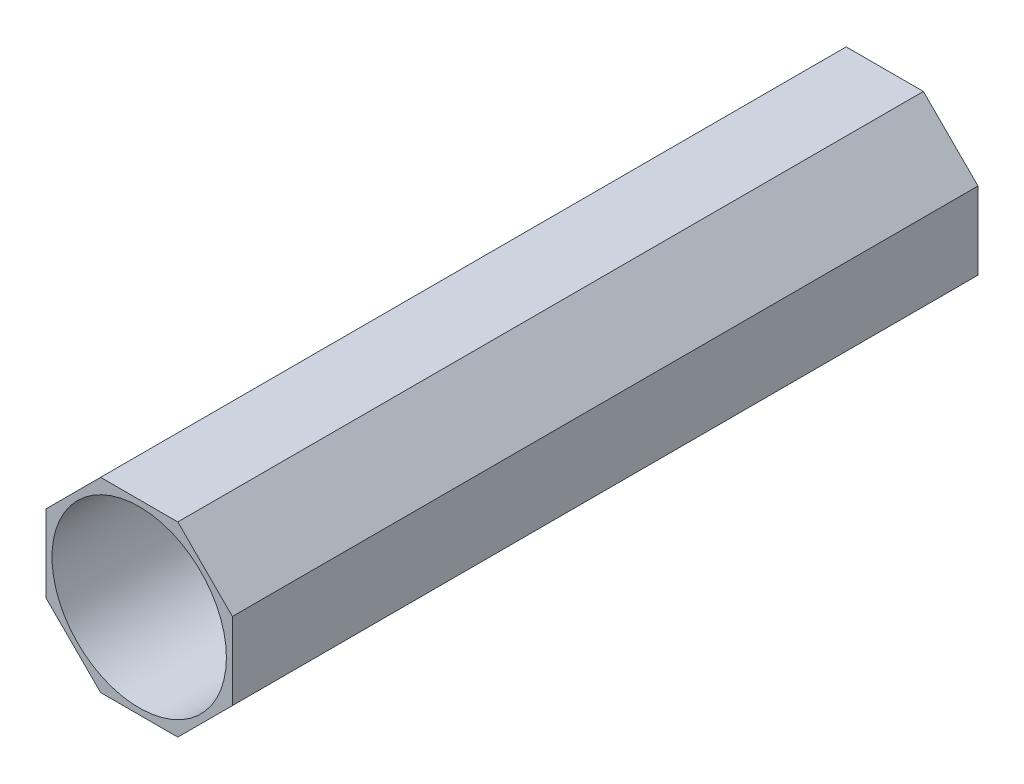
ISO-10303-21;
HEADER;
FILE_DESCRIPTION(('STEP AP214'),'2;1');
FILE_NAME('part.step','',(''),(''),'','','');
FILE_SCHEMA(('AUTOMOTIVE_DESIGN { 1 0 10303 214 1 1 1 1 }'));
ENDSEC;
DATA;
#1=APPLICATION_CONTEXT('core data for automotive mechanical design processes');
#2=APPLICATION_PROTOCOL_DEFINITION('international standard','automotive_design',2000,#1);
#3=PRODUCT_CONTEXT('',#1,'mechanical');
#4=PRODUCT('Part','Part','',(#3));
#5=PRODUCT_RELATED_PRODUCT_CATEGORY('part','',(#4));
#6=PRODUCT_DEFINITION_FORMATION('','',#4);
#7=PRODUCT_DEFINITION_CONTEXT('part definition',#1,'design');
#8=PRODUCT_DEFINITION('design','',#6,#7);
#9=PRODUCT_DEFINITION_SHAPE('','',#8);
#10=(LENGTH_UNIT() NAMED_UNIT(*) SI_UNIT(.MILLI.,.METRE.));
#11=(NAMED_UNIT(*) PLANE_ANGLE_UNIT() SI_UNIT($,.RADIAN.));
#12=(NAMED_UNIT(*) SI_UNIT($,.STERADIAN.) SOLID_ANGLE_UNIT());
#13=UNCERTAINTY_MEASURE_WITH_UNIT(LENGTH_MEASURE(1.E-05),#10,'distance_accuracy_value','');
#14=(GEOMETRIC_REPRESENTATION_CONTEXT(3) GLOBAL_UNCERTAINTY_ASSIGNED_CONTEXT((#13)) GLOBAL_UNIT_ASSIGNED_CONTEXT((#10,
#11,#12)) REPRESENTATION_CONTEXT('',''));
#15=CARTESIAN_POINT('',(0.,0.,0.));
#16=DIRECTION('',(0.,0.,1.));
#17=DIRECTION('',(1.,0.,0.));
#18=AXIS2_PLACEMENT_3D('',#15,#16,#17);
#19=CARTESIAN_POINT('',(0.,0.,50.));
#20=DIRECTION('',(0.,0.,1.));
#21=DIRECTION('',(1.,0.,0.));
#22=AXIS2_PLACEMENT_3D('',#19,#20,#21);
#23=PLANE('',#22);
#24=CARTESIAN_POINT('',(0.,0.,50.));
#25=DIRECTION('',(0.,0.,1.));
#26=DIRECTION('',(1.,0.,0.));
#27=AXIS2_PLACEMENT_3D('',#24,#25,#26);
#28=CIRCLE('',#27,11.);
#29=CARTESIAN_POINT('',(11.,0.,50.));
#30=VERTEX_POINT('',#29);
#31=EDGE_CURVE('E175',#30,#30,#28,.T.);
#32=ORIENTED_EDGE('',*,*,#31,.F.);
#33=EDGE_LOOP('',(#32));
#34=FACE_BOUND('',#33,.T.);
#35=CARTESIAN_POINT('',(0.,0.,50.));
#36=DIRECTION('',(0.,0.,1.));
#37=DIRECTION('',(1.,0.,0.));
#38=AXIS2_PLACEMENT_3D('',#35,#36,#37);
#39=CIRCLE('',#38,21.05);
#40=CARTESIAN_POINT('',(21.05,0.,50.));
#41=VERTEX_POINT('',#40);
#42=EDGE_CURVE('E102',#41,#41,#39,.T.);
#43=ORIENTED_EDGE('',*,*,#42,.T.);
#44=EDGE_LOOP('',(#43));
#45=FACE_BOUND('',#44,.T.);
#46=ADVANCED_FACE('F33',(#34,#45),#23,.T.);
#47=CARTESIAN_POINT('',(0.,0.,0.));
#48=DIRECTION('',(0.,0.,1.));
#49=DIRECTION('',(1.,0.,0.));
#50=AXIS2_PLACEMENT_3D('',#47,#48,#49);
#51=PLANE('',#50);
#52=CARTESIAN_POINT('',(0.,0.,0.));
#53=DIRECTION('',(0.,0.,1.));
#54=DIRECTION('',(1.,0.,0.));
#55=AXIS2_PLACEMENT_3D('',#52,#53,#54);
#56=CIRCLE('',#55,15.95);
#57=CARTESIAN_POINT('',(15.95,0.,0.));
#58=VERTEX_POINT('',#57);
#59=EDGE_CURVE('E186',#58,#58,#56,.T.);
#60=ORIENTED_EDGE('',*,*,#59,.T.);
#61=EDGE_LOOP('',(#60));
#62=FACE_BOUND('',#61,.T.);
#63=CARTESIAN_POINT('',(0.,0.,0.));
#64=DIRECTION('',(0.,0.,1.));
#65=DIRECTION('',(1.,0.,0.));
#66=AXIS2_PLACEMENT_3D('',#63,#64,#65);
#67=CIRCLE('',#66,21.05);
#68=CARTESIAN_POINT('',(21.05,0.,0.));
#69=VERTEX_POINT('',#68);
#70=EDGE_CURVE('E11',#69,#69,#67,.T.);
#71=ORIENTED_EDGE('',*,*,#70,.F.);
#72=EDGE_LOOP('',(#71));
#73=FACE_BOUND('',#72,.T.);
#74=ADVANCED_FACE('F191',(#62,#73),#51,.F.);
#75=CARTESIAN_POINT('',(0.,0.,-2.));
#76=DIRECTION('',(0.,0.,1.));
#77=DIRECTION('',(1.,0.,0.));
#78=AXIS2_PLACEMENT_3D('',#75,#76,#77);
#79=CYLINDRICAL_SURFACE('',#78,15.95);
#80=CARTESIAN_POINT('',(0.,0.,-2.));
#81=DIRECTION('',(0.,0.,1.));
#82=DIRECTION('',(1.,0.,0.));
#83=AXIS2_PLACEMENT_3D('',#80,#81,#82);
#84=CIRCLE('',#83,15.95);
#85=CARTESIAN_POINT('',(15.95,0.,-2.));
#86=VERTEX_POINT('',#85);
#87=EDGE_CURVE('E41',#86,#86,#84,.T.);
#88=ORIENTED_EDGE('',*,*,#87,.T.);
#89=EDGE_LOOP('',(#88));
#90=FACE_BOUND('',#89,.T.);
#91=ORIENTED_EDGE('',*,*,#59,.F.);
#92=EDGE_LOOP('',(#91));
#93=FACE_BOUND('',#92,.T.);
#94=ADVANCED_FACE('F35',(#90,#93),#79,.T.);
#95=CARTESIAN_POINT('',(0.,0.,-2.));
#96=DIRECTION('',(0.,0.,1.));
#97=DIRECTION('',(1.,0.,0.));
#98=AXIS2_PLACEMENT_3D('',#95,#96,#97);
#99=PLANE('',#98);
#100=CARTESIAN_POINT('',(0.,0.,-2.));
#101=DIRECTION('',(0.,0.,1.));
#102=DIRECTION('',(1.,0.,0.));
#103=AXIS2_PLACEMENT_3D('',#100,#101,#102);
#104=CIRCLE('',#103,14.05);
#105=CARTESIAN_POINT('',(14.05,0.,-2.));
#106=VERTEX_POINT('',#105);
#107=EDGE_CURVE('E183',#106,#106,#104,.T.);
#108=ORIENTED_EDGE('',*,*,#107,.T.);
#109=EDGE_LOOP('',(#108));
#110=FACE_BOUND('',#109,.T.);
#111=ORIENTED_EDGE('',*,*,#87,.F.);
#112=EDGE_LOOP('',(#111));
#113=FACE_BOUND('',#112,.T.);
#114=ADVANCED_FACE('F195',(#110,#113),#99,.F.);
#115=CARTESIAN_POINT('',(0.,0.,-2.));
#116=DIRECTION('',(0.,0.,1.));
#117=DIRECTION('',(1.,0.,0.));
#118=AXIS2_PLACEMENT_3D('',#115,#116,#117);
#119=CYLINDRICAL_SURFACE('',#118,14.05);
#120=ORIENTED_EDGE('',*,*,#107,.F.);
#121=EDGE_LOOP('',(#120));
#122=FACE_BOUND('',#121,.T.);
#123=CARTESIAN_POINT('',(0.,0.,0.));
#124=DIRECTION('',(0.,0.,1.));
#125=DIRECTION('',(1.,0.,0.));
#126=AXIS2_PLACEMENT_3D('',#123,#124,#125);
#127=CIRCLE('',#126,14.05);
#128=CARTESIAN_POINT('',(14.05,0.,0.));
#129=VERTEX_POINT('',#128);
#130=EDGE_CURVE('E178',#129,#129,#127,.F.);
#131=ORIENTED_EDGE('',*,*,#130,.F.);
#132=EDGE_LOOP('',(#131));
#133=FACE_BOUND('',#132,.T.);
#134=ADVANCED_FACE('F200',(#122,#133),#119,.F.);
#135=CARTESIAN_POINT('',(0.,0.,0.));
#136=DIRECTION('',(0.,0.,1.));
#137=DIRECTION('',(1.,0.,0.));
#138=AXIS2_PLACEMENT_3D('',#135,#136,#137);
#139=CIRCLE('',#138,11.);
#140=CARTESIAN_POINT('',(11.,0.,0.));
#141=VERTEX_POINT('',#140);
#142=EDGE_CURVE('E174',#141,#141,#139,.T.);
#143=ORIENTED_EDGE('',*,*,#142,.T.);
#144=EDGE_LOOP('',(#143));
#145=FACE_BOUND('',#144,.T.);
#146=ORIENTED_EDGE('',*,*,#130,.T.);
#147=EDGE_LOOP('',(#146));
#148=FACE_BOUND('',#147,.T.);
#149=ADVANCED_FACE('F204',(#145,#148),#51,.F.);
#150=CARTESIAN_POINT('',(0.,0.,50.));
#151=DIRECTION('',(0.,0.,-1.));
#152=DIRECTION('',(-1.,0.,0.));
#153=AXIS2_PLACEMENT_3D('',#150,#151,#152);
#154=CYLINDRICAL_SURFACE('',#153,11.);
#155=ORIENTED_EDGE('',*,*,#31,.T.);
#156=EDGE_LOOP('',(#155));
#157=FACE_BOUND('',#156,.T.);
#158=ORIENTED_EDGE('',*,*,#142,.F.);
#159=EDGE_LOOP('',(#158));
#160=FACE_BOUND('',#159,.T.);
#161=ADVANCED_FACE('F214',(#157,#160),#154,.F.);
#162=CARTESIAN_POINT('',(0.,0.,-70.));
#163=DIRECTION('',(0.,0.,1.));
#164=DIRECTION('',(1.,0.,0.));
#165=AXIS2_PLACEMENT_3D('',#162,#163,#164);
#166=CYLINDRICAL_SURFACE('',#165,21.05);
#167=CARTESIAN_POINT('',(0.,0.,-70.));
#168=DIRECTION('',(0.,0.,1.));
#169=DIRECTION('',(1.,0.,0.));
#170=AXIS2_PLACEMENT_3D('',#167,#168,#169);
#171=CIRCLE('',#170,21.05);
#172=CARTESIAN_POINT('',(21.05,0.,-70.));
#173=VERTEX_POINT('',#172);
#174=EDGE_CURVE('E137',#173,#173,#171,.T.);
#175=ORIENTED_EDGE('',*,*,#174,.F.);
#176=EDGE_LOOP('',(#175));
#177=FACE_BOUND('',#176,.T.);
#178=ORIENTED_EDGE('',*,*,#70,.T.);
#179=EDGE_LOOP('',(#178));
#180=FACE_BOUND('',#179,.T.);
#181=ADVANCED_FACE('F231',(#177,#180),#166,.F.);
#182=CARTESIAN_POINT('',(-22.5,-9.31980515339464,-70.));
#183=DIRECTION('',(-0.707106781186548,-0.707106781186548,0.));
#184=DIRECTION('',(0.707106781186547,-0.707106781186548,0.));
#185=AXIS2_PLACEMENT_3D('',#182,#183,#184);
#186=PLANE('',#185);
#187=DIRECTION('',(0.,0.,1.));
#188=VECTOR('',#187,1.);
#189=CARTESIAN_POINT('',(-9.31980515339465,-22.5,-70.));
#190=LINE('',#189,#188);
#191=CARTESIAN_POINT('',(-9.31980515339465,-22.5,-70.));
#192=VERTEX_POINT('',#191);
#193=CARTESIAN_POINT('',(-9.31980515339465,-22.5,110.));
#194=VERTEX_POINT('',#193);
#195=EDGE_CURVE('E107',#192,#194,#190,.T.);
#196=ORIENTED_EDGE('',*,*,#195,.T.);
#197=DIRECTION('',(0.707106781186547,-0.707106781186548,0.));
#198=VECTOR('',#197,1.);
#199=CARTESIAN_POINT('',(-22.5,-9.31980515339464,110.));
#200=LINE('',#199,#198);
#201=CARTESIAN_POINT('',(-22.5,-9.31980515339464,110.));
#202=VERTEX_POINT('',#201);
#203=EDGE_CURVE('E105',#202,#194,#200,.T.);
#204=ORIENTED_EDGE('',*,*,#203,.F.);
#205=DIRECTION('',(0.,0.,1.));
#206=VECTOR('',#205,1.);
#207=CARTESIAN_POINT('',(-22.5,-9.31980515339464,-70.));
#208=LINE('',#207,#206);
#209=CARTESIAN_POINT('',(-22.5,-9.31980515339464,-70.));
#210=VERTEX_POINT('',#209);
#211=EDGE_CURVE('E48',#210,#202,#208,.T.);
#212=ORIENTED_EDGE('',*,*,#211,.F.);
#213=DIRECTION('',(0.707106781186547,-0.707106781186548,0.));
#214=VECTOR('',#213,1.);
#215=CARTESIAN_POINT('',(-22.5,-9.31980515339464,-70.));
#216=LINE('',#215,#214);
#217=EDGE_CURVE('E140',#210,#192,#216,.T.);
#218=ORIENTED_EDGE('',*,*,#217,.T.);
#219=EDGE_LOOP('',(#196,#204,#212,#218));
#220=FACE_BOUND('',#219,.T.);
#221=ADVANCED_FACE('F106',(#220),#186,.T.);
#222=CARTESIAN_POINT('',(-22.5,9.31980515339465,-70.));
#223=DIRECTION('',(-1.,0.,0.));
#224=DIRECTION('',(0.,0.,1.));
#225=AXIS2_PLACEMENT_3D('',#222,#223,#224);
#226=PLANE('',#225);
#227=ORIENTED_EDGE('',*,*,#211,.T.);
#228=DIRECTION('',(0.,-1.,0.));
#229=VECTOR('',#228,1.);
#230=CARTESIAN_POINT('',(-22.5,9.31980515339465,110.));
#231=LINE('',#230,#229);
#232=CARTESIAN_POINT('',(-22.5,9.31980515339465,110.));
#233=VERTEX_POINT('',#232);
#234=EDGE_CURVE('E99',#233,#202,#231,.T.);
#235=ORIENTED_EDGE('',*,*,#234,.F.);
#236=DIRECTION('',(0.,0.,1.));
#237=VECTOR('',#236,1.);
#238=CARTESIAN_POINT('',(-22.5,9.31980515339465,-70.));
#239=LINE('',#238,#237);
#240=CARTESIAN_POINT('',(-22.5,9.31980515339465,-70.));
#241=VERTEX_POINT('',#240);
#242=EDGE_CURVE('E56',#241,#233,#239,.T.);
#243=ORIENTED_EDGE('',*,*,#242,.F.);
#244=DIRECTION('',(0.,-1.,0.));
#245=VECTOR('',#244,1.);
#246=CARTESIAN_POINT('',(-22.5,9.31980515339465,-70.));
#247=LINE('',#246,#245);
#248=EDGE_CURVE('E101',#241,#210,#247,.T.);
#249=ORIENTED_EDGE('',*,*,#248,.T.);
#250=EDGE_LOOP('',(#227,#235,#243,#249));
#251=FACE_BOUND('',#250,.T.);
#252=ADVANCED_FACE('F97',(#251),#226,.T.);
#253=CARTESIAN_POINT('',(-9.31980515339464,22.5,-70.));
#254=DIRECTION('',(-0.707106781186547,0.707106781186548,0.));
#255=DIRECTION('',(-0.707106781186548,-0.707106781186547,0.));
#256=AXIS2_PLACEMENT_3D('',#253,#254,#255);
#257=PLANE('',#256);
#258=ORIENTED_EDGE('',*,*,#242,.T.);
#259=DIRECTION('',(-0.707106781186548,-0.707106781186547,0.));
#260=VECTOR('',#259,1.);
#261=CARTESIAN_POINT('',(-9.31980515339464,22.5,110.));
#262=LINE('',#261,#260);
#263=CARTESIAN_POINT('',(-9.31980515339464,22.5,110.));
#264=VERTEX_POINT('',#263);
#265=EDGE_CURVE('E118',#264,#233,#262,.T.);
#266=ORIENTED_EDGE('',*,*,#265,.F.);
#267=DIRECTION('',(0.,0.,1.));
#268=VECTOR('',#267,1.);
#269=CARTESIAN_POINT('',(-9.31980515339464,22.5,-70.));
#270=LINE('',#269,#268);
#271=CARTESIAN_POINT('',(-9.31980515339464,22.5,-70.));
#272=VERTEX_POINT('',#271);
#273=EDGE_CURVE('E161',#272,#264,#270,.T.);
#274=ORIENTED_EDGE('',*,*,#273,.F.);
#275=DIRECTION('',(-0.707106781186548,-0.707106781186547,0.));
#276=VECTOR('',#275,1.);
#277=CARTESIAN_POINT('',(-9.31980515339464,22.5,-70.));
#278=LINE('',#277,#276);
#279=EDGE_CURVE('E157',#272,#241,#278,.T.);
#280=ORIENTED_EDGE('',*,*,#279,.T.);
#281=EDGE_LOOP('',(#258,#266,#274,#280));
#282=FACE_BOUND('',#281,.T.);
#283=ADVANCED_FACE('F270',(#282),#257,.T.);
#284=CARTESIAN_POINT('',(9.31980515339463,22.5,-70.));
#285=DIRECTION('',(0.,1.,0.));
#286=DIRECTION('',(0.,0.,1.));
#287=AXIS2_PLACEMENT_3D('',#284,#285,#286);
#288=PLANE('',#287);
#289=ORIENTED_EDGE('',*,*,#273,.T.);
#290=DIRECTION('',(-1.,0.,0.));
#291=VECTOR('',#290,1.);
#292=CARTESIAN_POINT('',(9.31980515339463,22.5,110.));
#293=LINE('',#292,#291);
#294=CARTESIAN_POINT('',(9.31980515339463,22.5,110.));
#295=VERTEX_POINT('',#294);
#296=EDGE_CURVE('E134',#295,#264,#293,.T.);
#297=ORIENTED_EDGE('',*,*,#296,.F.);
#298=DIRECTION('',(0.,0.,1.));
#299=VECTOR('',#298,1.);
#300=CARTESIAN_POINT('',(9.31980515339463,22.5,-70.));
#301=LINE('',#300,#299);
#302=CARTESIAN_POINT('',(9.31980515339463,22.5,-70.));
#303=VERTEX_POINT('',#302);
#304=EDGE_CURVE('E163',#303,#295,#301,.T.);
#305=ORIENTED_EDGE('',*,*,#304,.F.);
#306=DIRECTION('',(-1.,0.,0.));
#307=VECTOR('',#306,1.);
#308=CARTESIAN_POINT('',(9.31980515339463,22.5,-70.));
#309=LINE('',#308,#307);
#310=EDGE_CURVE('E154',#303,#272,#309,.T.);
#311=ORIENTED_EDGE('',*,*,#310,.T.);
#312=EDGE_LOOP('',(#289,#297,#305,#311));
#313=FACE_BOUND('',#312,.T.);
#314=ADVANCED_FACE('F273',(#313),#288,.T.);
#315=CARTESIAN_POINT('',(22.5,9.31980515339464,-70.));
#316=DIRECTION('',(0.707106781186548,0.707106781186548,0.));
#317=DIRECTION('',(-0.707106781186547,0.707106781186548,0.));
#318=AXIS2_PLACEMENT_3D('',#315,#316,#317);
#319=PLANE('',#318);
#320=ORIENTED_EDGE('',*,*,#304,.T.);
#321=DIRECTION('',(-0.707106781186547,0.707106781186548,0.));
#322=VECTOR('',#321,1.);
#323=CARTESIAN_POINT('',(22.5,9.31980515339464,110.));
#324=LINE('',#323,#322);
#325=CARTESIAN_POINT('',(22.5,9.31980515339464,110.));
#326=VERTEX_POINT('',#325);
#327=EDGE_CURVE('E131',#326,#295,#324,.T.);
#328=ORIENTED_EDGE('',*,*,#327,.F.);
#329=DIRECTION('',(0.,0.,1.));
#330=VECTOR('',#329,1.);
#331=CARTESIAN_POINT('',(22.5,9.31980515339464,-70.));
#332=LINE('',#331,#330);
#333=CARTESIAN_POINT('',(22.5,9.31980515339464,-70.));
#334=VERTEX_POINT('',#333);
#335=EDGE_CURVE('E165',#334,#326,#332,.T.);
#336=ORIENTED_EDGE('',*,*,#335,.F.);
#337=DIRECTION('',(-0.707106781186547,0.707106781186548,0.));
#338=VECTOR('',#337,1.);
#339=CARTESIAN_POINT('',(22.5,9.31980515339464,-70.));
#340=LINE('',#339,#338);
#341=EDGE_CURVE('E151',#334,#303,#340,.T.);
#342=ORIENTED_EDGE('',*,*,#341,.T.);
#343=EDGE_LOOP('',(#320,#328,#336,#342));
#344=FACE_BOUND('',#343,.T.);
#345=ADVANCED_FACE('F277',(#344),#319,.T.);
#346=CARTESIAN_POINT('',(22.5,-9.31980515339464,-70.));
#347=DIRECTION('',(1.,0.,0.));
#348=DIRECTION('',(0.,1.,0.));
#349=AXIS2_PLACEMENT_3D('',#346,#347,#348);
#350=PLANE('',#349);
#351=ORIENTED_EDGE('',*,*,#335,.T.);
#352=DIRECTION('',(0.,1.,0.));
#353=VECTOR('',#352,1.);
#354=CARTESIAN_POINT('',(22.5,-9.31980515339464,110.));
#355=LINE('',#354,#353);
#356=CARTESIAN_POINT('',(22.5,-9.31980515339464,110.));
#357=VERTEX_POINT('',#356);
#358=EDGE_CURVE('E128',#357,#326,#355,.T.);
#359=ORIENTED_EDGE('',*,*,#358,.F.);
#360=DIRECTION('',(0.,0.,1.));
#361=VECTOR('',#360,1.);
#362=CARTESIAN_POINT('',(22.5,-9.31980515339464,-70.));
#363=LINE('',#362,#361);
#364=CARTESIAN_POINT('',(22.5,-9.31980515339464,-70.));
#365=VERTEX_POINT('',#364);
#366=EDGE_CURVE('E167',#365,#357,#363,.T.);
#367=ORIENTED_EDGE('',*,*,#366,.F.);
#368=DIRECTION('',(0.,1.,0.));
#369=VECTOR('',#368,1.);
#370=CARTESIAN_POINT('',(22.5,-9.31980515339464,-70.));
#371=LINE('',#370,#369);
#372=EDGE_CURVE('E148',#365,#334,#371,.T.);
#373=ORIENTED_EDGE('',*,*,#372,.T.);
#374=EDGE_LOOP('',(#351,#359,#367,#373));
#375=FACE_BOUND('',#374,.T.);
#376=ADVANCED_FACE('F281',(#375),#350,.T.);
#377=CARTESIAN_POINT('',(9.31980515339464,-22.5,-70.));
#378=DIRECTION('',(0.707106781186548,-0.707106781186548,0.));
#379=DIRECTION('',(0.707106781186548,0.707106781186547,0.));
#380=AXIS2_PLACEMENT_3D('',#377,#378,#379);
#381=PLANE('',#380);
#382=ORIENTED_EDGE('',*,*,#366,.T.);
#383=DIRECTION('',(0.707106781186548,0.707106781186547,0.));
#384=VECTOR('',#383,1.);
#385=CARTESIAN_POINT('',(9.31980515339464,-22.5,110.));
#386=LINE('',#385,#384);
#387=CARTESIAN_POINT('',(9.31980515339464,-22.5,110.));
#388=VERTEX_POINT('',#387);
#389=EDGE_CURVE('E125',#388,#357,#386,.T.);
#390=ORIENTED_EDGE('',*,*,#389,.F.);
#391=DIRECTION('',(0.,0.,1.));
#392=VECTOR('',#391,1.);
#393=CARTESIAN_POINT('',(9.31980515339464,-22.5,-70.));
#394=LINE('',#393,#392);
#395=CARTESIAN_POINT('',(9.31980515339464,-22.5,-70.));
#396=VERTEX_POINT('',#395);
#397=EDGE_CURVE('E169',#396,#388,#394,.T.);
#398=ORIENTED_EDGE('',*,*,#397,.F.);
#399=DIRECTION('',(0.707106781186548,0.707106781186547,0.));
#400=VECTOR('',#399,1.);
#401=CARTESIAN_POINT('',(9.31980515339464,-22.5,-70.));
#402=LINE('',#401,#400);
#403=EDGE_CURVE('E145',#396,#365,#402,.T.);
#404=ORIENTED_EDGE('',*,*,#403,.T.);
#405=EDGE_LOOP('',(#382,#390,#398,#404));
#406=FACE_BOUND('',#405,.T.);
#407=ADVANCED_FACE('F263',(#406),#381,.T.);
#408=CARTESIAN_POINT('',(-9.31980515339465,-22.5,-70.));
#409=DIRECTION('',(0.,-1.,0.));
#410=DIRECTION('',(1.,0.,0.));
#411=AXIS2_PLACEMENT_3D('',#408,#409,#410);
#412=PLANE('',#411);
#413=ORIENTED_EDGE('',*,*,#397,.T.);
#414=DIRECTION('',(1.,0.,0.));
#415=VECTOR('',#414,1.);
#416=CARTESIAN_POINT('',(-9.31980515339465,-22.5,110.));
#417=LINE('',#416,#415);
#418=EDGE_CURVE('E111',#194,#388,#417,.T.);
#419=ORIENTED_EDGE('',*,*,#418,.F.);
#420=ORIENTED_EDGE('',*,*,#195,.F.);
#421=DIRECTION('',(1.,0.,0.));
#422=VECTOR('',#421,1.);
#423=CARTESIAN_POINT('',(-9.31980515339465,-22.5,-70.));
#424=LINE('',#423,#422);
#425=EDGE_CURVE('E142',#192,#396,#424,.T.);
#426=ORIENTED_EDGE('',*,*,#425,.T.);
#427=EDGE_LOOP('',(#413,#419,#420,#426));
#428=FACE_BOUND('',#427,.T.);
#429=ADVANCED_FACE('F255',(#428),#412,.T.);
#430=CARTESIAN_POINT('',(0.,0.,-70.));
#431=DIRECTION('',(0.,0.,1.));
#432=DIRECTION('',(1.,0.,0.));
#433=AXIS2_PLACEMENT_3D('',#430,#431,#432);
#434=PLANE('',#433);
#435=ORIENTED_EDGE('',*,*,#174,.T.);
#436=EDGE_LOOP('',(#435));
#437=FACE_BOUND('',#436,.T.);
#438=ORIENTED_EDGE('',*,*,#217,.F.);
#439=ORIENTED_EDGE('',*,*,#248,.F.);
#440=ORIENTED_EDGE('',*,*,#279,.F.);
#441=ORIENTED_EDGE('',*,*,#310,.F.);
#442=ORIENTED_EDGE('',*,*,#341,.F.);
#443=ORIENTED_EDGE('',*,*,#372,.F.);
#444=ORIENTED_EDGE('',*,*,#403,.F.);
#445=ORIENTED_EDGE('',*,*,#425,.F.);
#446=EDGE_LOOP('',(#438,#439,#440,#441,#442,#443,#444,#445));
#447=FACE_BOUND('',#446,.T.);
#448=ADVANCED_FACE('F249',(#437,#447),#434,.F.);
#449=ORIENTED_EDGE('',*,*,#42,.F.);
#450=EDGE_LOOP('',(#449));
#451=FACE_BOUND('',#450,.T.);
#452=CARTESIAN_POINT('',(0.,0.,110.));
#453=DIRECTION('',(0.,0.,1.));
#454=DIRECTION('',(1.,0.,0.));
#455=AXIS2_PLACEMENT_3D('',#452,#453,#454);
#456=CIRCLE('',#455,21.05);
#457=CARTESIAN_POINT('',(21.05,0.,110.));
#458=VERTEX_POINT('',#457);
#459=EDGE_CURVE('E119',#458,#458,#456,.T.);
#460=ORIENTED_EDGE('',*,*,#459,.T.);
#461=EDGE_LOOP('',(#460));
#462=FACE_BOUND('',#461,.T.);
#463=ADVANCED_FACE('F240',(#451,#462),#166,.F.);
#464=CARTESIAN_POINT('',(0.,0.,110.));
#465=DIRECTION('',(0.,0.,1.));
#466=DIRECTION('',(1.,0.,0.));
#467=AXIS2_PLACEMENT_3D('',#464,#465,#466);
#468=PLANE('',#467);
#469=ORIENTED_EDGE('',*,*,#234,.T.);
#470=ORIENTED_EDGE('',*,*,#203,.T.);
#471=ORIENTED_EDGE('',*,*,#418,.T.);
#472=ORIENTED_EDGE('',*,*,#389,.T.);
#473=ORIENTED_EDGE('',*,*,#358,.T.);
#474=ORIENTED_EDGE('',*,*,#327,.T.);
#475=ORIENTED_EDGE('',*,*,#296,.T.);
#476=ORIENTED_EDGE('',*,*,#265,.T.);
#477=EDGE_LOOP('',(#469,#470,#471,#472,#473,#474,#475,#476));
#478=FACE_BOUND('',#477,.T.);
#479=ORIENTED_EDGE('',*,*,#459,.F.);
#480=EDGE_LOOP('',(#479));
#481=FACE_BOUND('',#480,.T.);
#482=ADVANCED_FACE('F114',(#478,#481),#468,.T.);
#483=CLOSED_SHELL('',(#46,#74,#94,#114,#134,#149,#161,#181,#221,#252,#283,#314,#345,#376,#407,
#429,#448,#463,#482));
#484=MANIFOLD_SOLID_BREP('B2',#483);
#485=ADVANCED_BREP_SHAPE_REPRESENTATION('',(#18,#484),#14);
#486=SHAPE_DEFINITION_REPRESENTATION(#9,#485);
ENDSEC;
END-ISO-10303-21;
